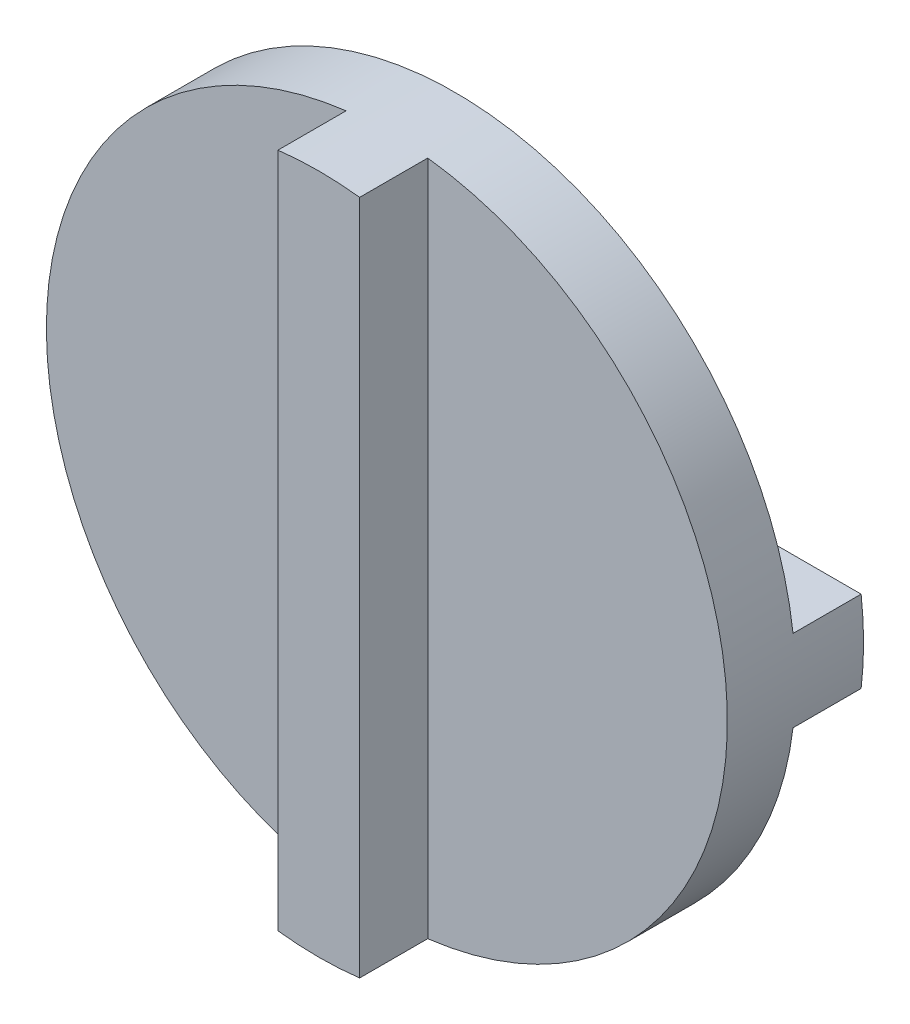
ISO-10303-21;
HEADER;
FILE_DESCRIPTION(('STEP AP214'),'2;1');
FILE_NAME('part.step','',(''),(''),'','','');
FILE_SCHEMA(('AUTOMOTIVE_DESIGN { 1 0 10303 214 1 1 1 1 }'));
ENDSEC;
DATA;
#1=APPLICATION_CONTEXT('core data for automotive mechanical design processes');
#2=APPLICATION_PROTOCOL_DEFINITION('international standard','automotive_design',2000,#1);
#3=PRODUCT_CONTEXT('',#1,'mechanical');
#4=PRODUCT('Part','Part','',(#3));
#5=PRODUCT_RELATED_PRODUCT_CATEGORY('part','',(#4));
#6=PRODUCT_DEFINITION_FORMATION('','',#4);
#7=PRODUCT_DEFINITION_CONTEXT('part definition',#1,'design');
#8=PRODUCT_DEFINITION('design','',#6,#7);
#9=PRODUCT_DEFINITION_SHAPE('','',#8);
#10=(LENGTH_UNIT() NAMED_UNIT(*) SI_UNIT(.MILLI.,.METRE.));
#11=(NAMED_UNIT(*) PLANE_ANGLE_UNIT() SI_UNIT($,.RADIAN.));
#12=(NAMED_UNIT(*) SI_UNIT($,.STERADIAN.) SOLID_ANGLE_UNIT());
#13=UNCERTAINTY_MEASURE_WITH_UNIT(LENGTH_MEASURE(1.E-05),#10,'distance_accuracy_value','');
#14=(GEOMETRIC_REPRESENTATION_CONTEXT(3) GLOBAL_UNCERTAINTY_ASSIGNED_CONTEXT((#13)) GLOBAL_UNIT_ASSIGNED_CONTEXT((#10,
#11,#12)) REPRESENTATION_CONTEXT('',''));
#15=CARTESIAN_POINT('',(0.,0.,0.));
#16=DIRECTION('',(0.,0.,1.));
#17=DIRECTION('',(1.,0.,0.));
#18=AXIS2_PLACEMENT_3D('',#15,#16,#17);
#19=CARTESIAN_POINT('',(0.,0.,10.));
#20=DIRECTION('',(0.,0.,1.));
#21=DIRECTION('',(1.,0.,0.));
#22=AXIS2_PLACEMENT_3D('',#19,#20,#21);
#23=PLANE('',#22);
#24=DIRECTION('',(0.,1.,0.));
#25=VECTOR('',#24,1.);
#26=CARTESIAN_POINT('',(6.00000000000002,-49.6386945839634,10.));
#27=LINE('',#26,#25);
#28=CARTESIAN_POINT('',(6.00000000000002,-49.6386945839634,10.));
#29=VERTEX_POINT('',#28);
#30=CARTESIAN_POINT('',(6.00000000000002,49.6386945839634,10.));
#31=VERTEX_POINT('',#30);
#32=EDGE_CURVE('E54',#29,#31,#27,.T.);
#33=ORIENTED_EDGE('',*,*,#32,.F.);
#34=CARTESIAN_POINT('',(0.,0.,10.));
#35=DIRECTION('',(0.,0.,1.));
#36=DIRECTION('',(1.,0.,0.));
#37=AXIS2_PLACEMENT_3D('',#34,#35,#36);
#38=CIRCLE('',#37,50.);
#39=EDGE_CURVE('E48',#29,#31,#38,.T.);
#40=ORIENTED_EDGE('',*,*,#39,.T.);
#41=EDGE_LOOP('',(#33,#40));
#42=FACE_BOUND('',#41,.T.);
#43=ADVANCED_FACE('F39',(#42),#23,.T.);
#44=CARTESIAN_POINT('',(0.,0.,0.));
#45=DIRECTION('',(0.,0.,1.));
#46=DIRECTION('',(1.,0.,0.));
#47=AXIS2_PLACEMENT_3D('',#44,#45,#46);
#48=PLANE('',#47);
#49=DIRECTION('',(1.,0.,0.));
#50=VECTOR('',#49,1.);
#51=CARTESIAN_POINT('',(49.6386945839634,6.,0.));
#52=LINE('',#51,#50);
#53=CARTESIAN_POINT('',(-49.6386945839634,6.,0.));
#54=VERTEX_POINT('',#53);
#55=CARTESIAN_POINT('',(49.6386945839634,6.,0.));
#56=VERTEX_POINT('',#55);
#57=EDGE_CURVE('E128',#54,#56,#52,.T.);
#58=ORIENTED_EDGE('',*,*,#57,.F.);
#59=CARTESIAN_POINT('',(0.,0.,0.));
#60=DIRECTION('',(0.,0.,1.));
#61=DIRECTION('',(1.,0.,0.));
#62=AXIS2_PLACEMENT_3D('',#59,#60,#61);
#63=CIRCLE('',#62,50.);
#64=EDGE_CURVE('E43',#56,#54,#63,.T.);
#65=ORIENTED_EDGE('',*,*,#64,.F.);
#66=EDGE_LOOP('',(#58,#65));
#67=FACE_BOUND('',#66,.T.);
#68=ADVANCED_FACE('F174',(#67),#48,.F.);
#69=DIRECTION('',(-1.,0.,0.));
#70=VECTOR('',#69,1.);
#71=CARTESIAN_POINT('',(49.6386945839634,-6.,0.));
#72=LINE('',#71,#70);
#73=CARTESIAN_POINT('',(49.6386945839634,-6.,0.));
#74=VERTEX_POINT('',#73);
#75=CARTESIAN_POINT('',(-49.6386945839634,-6.00000000000001,0.));
#76=VERTEX_POINT('',#75);
#77=EDGE_CURVE('E125',#74,#76,#72,.T.);
#78=ORIENTED_EDGE('',*,*,#77,.F.);
#79=EDGE_CURVE('E156',#76,#74,#63,.T.);
#80=ORIENTED_EDGE('',*,*,#79,.F.);
#81=EDGE_LOOP('',(#78,#80));
#82=FACE_BOUND('',#81,.T.);
#83=ADVANCED_FACE('F176',(#82),#48,.F.);
#84=CARTESIAN_POINT('',(0.,0.,10.));
#85=DIRECTION('',(0.,0.,-1.));
#86=DIRECTION('',(-1.,0.,0.));
#87=AXIS2_PLACEMENT_3D('',#84,#85,#86);
#88=CYLINDRICAL_SURFACE('',#87,50.);
#89=CARTESIAN_POINT('',(-5.99999999999998,49.6386945839634,10.));
#90=VERTEX_POINT('',#89);
#91=CARTESIAN_POINT('',(-5.99999999999998,-49.6386945839634,10.));
#92=VERTEX_POINT('',#91);
#93=EDGE_CURVE('E11',#90,#92,#38,.T.);
#94=ORIENTED_EDGE('',*,*,#93,.F.);
#95=DIRECTION('',(0.,0.,-1.));
#96=VECTOR('',#95,1.);
#97=CARTESIAN_POINT('',(-5.99999999999998,49.6386945839634,20.));
#98=LINE('',#97,#96);
#99=CARTESIAN_POINT('',(-5.99999999999998,49.6386945839634,20.));
#100=VERTEX_POINT('',#99);
#101=EDGE_CURVE('E108',#100,#90,#98,.T.);
#102=ORIENTED_EDGE('',*,*,#101,.F.);
#103=CARTESIAN_POINT('',(0.,0.,20.));
#104=DIRECTION('',(0.,0.,1.));
#105=DIRECTION('',(1.,0.,0.));
#106=AXIS2_PLACEMENT_3D('',#103,#104,#105);
#107=CIRCLE('',#106,50.);
#108=CARTESIAN_POINT('',(6.00000000000002,49.6386945839634,20.));
#109=VERTEX_POINT('',#108);
#110=EDGE_CURVE('E114',#109,#100,#107,.T.);
#111=ORIENTED_EDGE('',*,*,#110,.F.);
#112=DIRECTION('',(0.,0.,-1.));
#113=VECTOR('',#112,1.);
#114=CARTESIAN_POINT('',(6.00000000000002,49.6386945839634,20.));
#115=LINE('',#114,#113);
#116=EDGE_CURVE('E276',#109,#31,#115,.T.);
#117=ORIENTED_EDGE('',*,*,#116,.T.);
#118=ORIENTED_EDGE('',*,*,#39,.F.);
#119=DIRECTION('',(0.,0.,-1.));
#120=VECTOR('',#119,1.);
#121=CARTESIAN_POINT('',(5.99999999999999,-49.6386945839634,20.));
#122=LINE('',#121,#120);
#123=CARTESIAN_POINT('',(5.99999999999999,-49.6386945839634,20.));
#124=VERTEX_POINT('',#123);
#125=EDGE_CURVE('E130',#124,#29,#122,.T.);
#126=ORIENTED_EDGE('',*,*,#125,.F.);
#127=CARTESIAN_POINT('',(0.,0.,20.));
#128=DIRECTION('',(0.,0.,1.));
#129=DIRECTION('',(1.,0.,0.));
#130=AXIS2_PLACEMENT_3D('',#127,#128,#129);
#131=CIRCLE('',#130,50.);
#132=CARTESIAN_POINT('',(-5.99999999999998,-49.6386945839634,20.));
#133=VERTEX_POINT('',#132);
#134=EDGE_CURVE('E113',#133,#124,#131,.T.);
#135=ORIENTED_EDGE('',*,*,#134,.F.);
#136=DIRECTION('',(0.,0.,-1.));
#137=VECTOR('',#136,1.);
#138=CARTESIAN_POINT('',(-5.99999999999998,-49.6386945839634,20.));
#139=LINE('',#138,#137);
#140=EDGE_CURVE('E110',#133,#92,#139,.T.);
#141=ORIENTED_EDGE('',*,*,#140,.T.);
#142=EDGE_LOOP('',(#94,#102,#111,#117,#118,#126,#135,#141));
#143=FACE_BOUND('',#142,.T.);
#144=ORIENTED_EDGE('',*,*,#64,.T.);
#145=DIRECTION('',(0.,0.,1.));
#146=VECTOR('',#145,1.);
#147=CARTESIAN_POINT('',(-49.6386945839634,6.,-10.));
#148=LINE('',#147,#146);
#149=CARTESIAN_POINT('',(-49.6386945839634,6.,-10.));
#150=VERTEX_POINT('',#149);
#151=EDGE_CURVE('E148',#150,#54,#148,.T.);
#152=ORIENTED_EDGE('',*,*,#151,.F.);
#153=CARTESIAN_POINT('',(0.,0.,-10.));
#154=DIRECTION('',(0.,0.,-1.));
#155=DIRECTION('',(-1.,0.,0.));
#156=AXIS2_PLACEMENT_3D('',#153,#154,#155);
#157=CIRCLE('',#156,50.);
#158=CARTESIAN_POINT('',(-49.6386945839634,-6.00000000000001,-10.));
#159=VERTEX_POINT('',#158);
#160=EDGE_CURVE('E139',#159,#150,#157,.T.);
#161=ORIENTED_EDGE('',*,*,#160,.F.);
#162=DIRECTION('',(0.,0.,1.));
#163=VECTOR('',#162,1.);
#164=CARTESIAN_POINT('',(-49.6386945839634,-6.00000000000001,-10.));
#165=LINE('',#164,#163);
#166=EDGE_CURVE('E151',#159,#76,#165,.T.);
#167=ORIENTED_EDGE('',*,*,#166,.T.);
#168=ORIENTED_EDGE('',*,*,#79,.T.);
#169=DIRECTION('',(0.,0.,1.));
#170=VECTOR('',#169,1.);
#171=CARTESIAN_POINT('',(49.6386945839634,-6.,-10.));
#172=LINE('',#171,#170);
#173=CARTESIAN_POINT('',(49.6386945839634,-6.,-10.));
#174=VERTEX_POINT('',#173);
#175=EDGE_CURVE('E154',#174,#74,#172,.T.);
#176=ORIENTED_EDGE('',*,*,#175,.F.);
#177=CARTESIAN_POINT('',(0.,0.,-10.));
#178=DIRECTION('',(0.,0.,-1.));
#179=DIRECTION('',(-1.,0.,0.));
#180=AXIS2_PLACEMENT_3D('',#177,#178,#179);
#181=CIRCLE('',#180,50.);
#182=CARTESIAN_POINT('',(49.6386945839634,6.,-10.));
#183=VERTEX_POINT('',#182);
#184=EDGE_CURVE('E134',#183,#174,#181,.T.);
#185=ORIENTED_EDGE('',*,*,#184,.F.);
#186=DIRECTION('',(0.,0.,1.));
#187=VECTOR('',#186,1.);
#188=CARTESIAN_POINT('',(49.6386945839634,6.,-10.));
#189=LINE('',#188,#187);
#190=EDGE_CURVE('E142',#183,#56,#189,.T.);
#191=ORIENTED_EDGE('',*,*,#190,.T.);
#192=EDGE_LOOP('',(#144,#152,#161,#167,#168,#176,#185,#191));
#193=FACE_BOUND('',#192,.T.);
#194=ADVANCED_FACE('F41',(#143,#193),#88,.T.);
#195=DIRECTION('',(0.,-1.,0.));
#196=VECTOR('',#195,1.);
#197=CARTESIAN_POINT('',(-5.99999999999998,49.6386945839634,10.));
#198=LINE('',#197,#196);
#199=EDGE_CURVE('E60',#90,#92,#198,.T.);
#200=ORIENTED_EDGE('',*,*,#199,.F.);
#201=ORIENTED_EDGE('',*,*,#93,.T.);
#202=EDGE_LOOP('',(#200,#201));
#203=FACE_BOUND('',#202,.T.);
#204=ADVANCED_FACE('F182',(#203),#23,.T.);
#205=CARTESIAN_POINT('',(49.6386945839634,-6.,-10.));
#206=DIRECTION('',(0.,1.,0.));
#207=DIRECTION('',(0.,0.,1.));
#208=AXIS2_PLACEMENT_3D('',#205,#206,#207);
#209=PLANE('',#208);
#210=ORIENTED_EDGE('',*,*,#77,.T.);
#211=ORIENTED_EDGE('',*,*,#166,.F.);
#212=DIRECTION('',(-1.,0.,0.));
#213=VECTOR('',#212,1.);
#214=CARTESIAN_POINT('',(49.6386945839634,-6.,-10.));
#215=LINE('',#214,#213);
#216=EDGE_CURVE('E137',#174,#159,#215,.T.);
#217=ORIENTED_EDGE('',*,*,#216,.F.);
#218=ORIENTED_EDGE('',*,*,#175,.T.);
#219=EDGE_LOOP('',(#210,#211,#217,#218));
#220=FACE_BOUND('',#219,.T.);
#221=ADVANCED_FACE('F166',(#220),#209,.F.);
#222=CARTESIAN_POINT('',(49.6386945839634,6.,-10.));
#223=DIRECTION('',(0.,-1.,0.));
#224=DIRECTION('',(0.,0.,-1.));
#225=AXIS2_PLACEMENT_3D('',#222,#223,#224);
#226=PLANE('',#225);
#227=ORIENTED_EDGE('',*,*,#57,.T.);
#228=ORIENTED_EDGE('',*,*,#190,.F.);
#229=DIRECTION('',(1.,0.,0.));
#230=VECTOR('',#229,1.);
#231=CARTESIAN_POINT('',(49.6386945839634,6.,-10.));
#232=LINE('',#231,#230);
#233=EDGE_CURVE('E141',#150,#183,#232,.T.);
#234=ORIENTED_EDGE('',*,*,#233,.F.);
#235=ORIENTED_EDGE('',*,*,#151,.T.);
#236=EDGE_LOOP('',(#227,#228,#234,#235));
#237=FACE_BOUND('',#236,.T.);
#238=ADVANCED_FACE('F172',(#237),#226,.F.);
#239=CARTESIAN_POINT('',(0.,0.,-10.));
#240=DIRECTION('',(0.,0.,-1.));
#241=DIRECTION('',(-1.,0.,0.));
#242=AXIS2_PLACEMENT_3D('',#239,#240,#241);
#243=PLANE('',#242);
#244=ORIENTED_EDGE('',*,*,#184,.T.);
#245=ORIENTED_EDGE('',*,*,#216,.T.);
#246=ORIENTED_EDGE('',*,*,#160,.T.);
#247=ORIENTED_EDGE('',*,*,#233,.T.);
#248=EDGE_LOOP('',(#244,#245,#246,#247));
#249=FACE_BOUND('',#248,.T.);
#250=ADVANCED_FACE('F168',(#249),#243,.T.);
#251=CARTESIAN_POINT('',(-5.99999999999998,49.6386945839634,20.));
#252=DIRECTION('',(1.,0.,0.));
#253=DIRECTION('',(0.,0.,-1.));
#254=AXIS2_PLACEMENT_3D('',#251,#252,#253);
#255=PLANE('',#254);
#256=ORIENTED_EDGE('',*,*,#199,.T.);
#257=ORIENTED_EDGE('',*,*,#140,.F.);
#258=DIRECTION('',(0.,-1.,0.));
#259=VECTOR('',#258,1.);
#260=CARTESIAN_POINT('',(-5.99999999999998,49.6386945839634,20.));
#261=LINE('',#260,#259);
#262=EDGE_CURVE('E104',#100,#133,#261,.T.);
#263=ORIENTED_EDGE('',*,*,#262,.F.);
#264=ORIENTED_EDGE('',*,*,#101,.T.);
#265=EDGE_LOOP('',(#256,#257,#263,#264));
#266=FACE_BOUND('',#265,.T.);
#267=ADVANCED_FACE('F106',(#266),#255,.F.);
#268=CARTESIAN_POINT('',(6.00000000000002,-49.6386945839634,20.));
#269=DIRECTION('',(-1.,0.,0.));
#270=DIRECTION('',(0.,0.,1.));
#271=AXIS2_PLACEMENT_3D('',#268,#269,#270);
#272=PLANE('',#271);
#273=ORIENTED_EDGE('',*,*,#32,.T.);
#274=ORIENTED_EDGE('',*,*,#116,.F.);
#275=DIRECTION('',(0.,1.,0.));
#276=VECTOR('',#275,1.);
#277=CARTESIAN_POINT('',(6.00000000000002,-49.6386945839634,20.));
#278=LINE('',#277,#276);
#279=EDGE_CURVE('E119',#124,#109,#278,.T.);
#280=ORIENTED_EDGE('',*,*,#279,.F.);
#281=ORIENTED_EDGE('',*,*,#125,.T.);
#282=EDGE_LOOP('',(#273,#274,#280,#281));
#283=FACE_BOUND('',#282,.T.);
#284=ADVANCED_FACE('F193',(#283),#272,.F.);
#285=CARTESIAN_POINT('',(0.,0.,20.));
#286=DIRECTION('',(0.,0.,1.));
#287=DIRECTION('',(1.,0.,0.));
#288=AXIS2_PLACEMENT_3D('',#285,#286,#287);
#289=PLANE('',#288);
#290=ORIENTED_EDGE('',*,*,#110,.T.);
#291=ORIENTED_EDGE('',*,*,#262,.T.);
#292=ORIENTED_EDGE('',*,*,#134,.T.);
#293=ORIENTED_EDGE('',*,*,#279,.T.);
#294=EDGE_LOOP('',(#290,#291,#292,#293));
#295=FACE_BOUND('',#294,.T.);
#296=ADVANCED_FACE('F117',(#295),#289,.T.);
#297=CLOSED_SHELL('',(#43,#68,#83,#194,#204,#221,#238,#250,#267,#284,#296));
#298=MANIFOLD_SOLID_BREP('B2',#297);
#299=ADVANCED_BREP_SHAPE_REPRESENTATION('',(#18,#298),#14);
#300=SHAPE_DEFINITION_REPRESENTATION(#9,#299);
ENDSEC;
END-ISO-10303-21;
